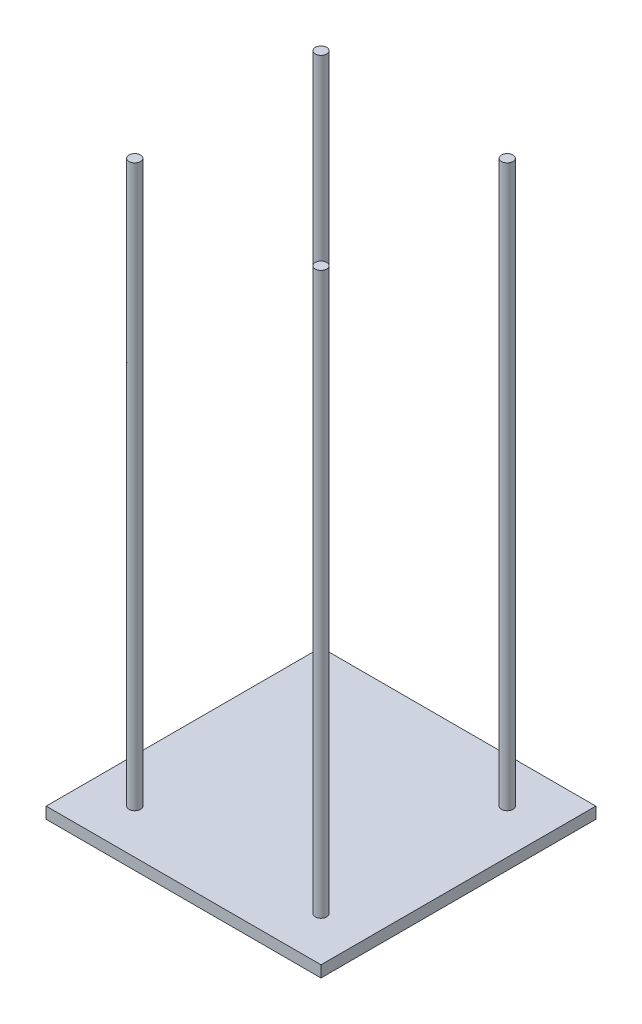
ISO-10303-21;
HEADER;
FILE_DESCRIPTION(('STEP AP214'),'2;1');
FILE_NAME('part.step','',(''),(''),'','','');
FILE_SCHEMA(('AUTOMOTIVE_DESIGN { 1 0 10303 214 1 1 1 1 }'));
ENDSEC;
DATA;
#1=APPLICATION_CONTEXT('core data for automotive mechanical design processes');
#2=APPLICATION_PROTOCOL_DEFINITION('international standard','automotive_design',2000,#1);
#3=PRODUCT_CONTEXT('',#1,'mechanical');
#4=PRODUCT('Part','Part','',(#3));
#5=PRODUCT_RELATED_PRODUCT_CATEGORY('part','',(#4));
#6=PRODUCT_DEFINITION_FORMATION('','',#4);
#7=PRODUCT_DEFINITION_CONTEXT('part definition',#1,'design');
#8=PRODUCT_DEFINITION('design','',#6,#7);
#9=PRODUCT_DEFINITION_SHAPE('','',#8);
#10=(LENGTH_UNIT() NAMED_UNIT(*) SI_UNIT(.MILLI.,.METRE.));
#11=(NAMED_UNIT(*) PLANE_ANGLE_UNIT() SI_UNIT($,.RADIAN.));
#12=(NAMED_UNIT(*) SI_UNIT($,.STERADIAN.) SOLID_ANGLE_UNIT());
#13=UNCERTAINTY_MEASURE_WITH_UNIT(LENGTH_MEASURE(1.E-05),#10,'distance_accuracy_value','');
#14=(GEOMETRIC_REPRESENTATION_CONTEXT(3) GLOBAL_UNCERTAINTY_ASSIGNED_CONTEXT((#13)) GLOBAL_UNIT_ASSIGNED_CONTEXT((#10,
#11,#12)) REPRESENTATION_CONTEXT('',''));
#15=CARTESIAN_POINT('',(0.,0.,0.));
#16=DIRECTION('',(0.,0.,1.));
#17=DIRECTION('',(1.,0.,0.));
#18=AXIS2_PLACEMENT_3D('',#15,#16,#17);
#19=CARTESIAN_POINT('',(60.0000000000006,5.,0.));
#20=DIRECTION('',(1.,0.,0.));
#21=DIRECTION('',(0.,0.,-1.));
#22=AXIS2_PLACEMENT_3D('',#19,#20,#21);
#23=PLANE('',#22);
#24=DIRECTION('',(0.,0.,1.));
#25=VECTOR('',#24,1.);
#26=CARTESIAN_POINT('',(60.0000000000006,0.,0.));
#27=LINE('',#26,#25);
#28=CARTESIAN_POINT('',(60.0000000000006,0.,-60.));
#29=VERTEX_POINT('',#28);
#30=CARTESIAN_POINT('',(60.0000000000007,0.,60.));
#31=VERTEX_POINT('',#30);
#32=EDGE_CURVE('E119',#29,#31,#27,.T.);
#33=ORIENTED_EDGE('',*,*,#32,.F.);
#34=DIRECTION('',(0.,-1.,0.));
#35=VECTOR('',#34,1.);
#36=CARTESIAN_POINT('',(60.0000000000006,5.,-60.));
#37=LINE('',#36,#35);
#38=CARTESIAN_POINT('',(60.0000000000006,5.,-60.));
#39=VERTEX_POINT('',#38);
#40=EDGE_CURVE('E11',#39,#29,#37,.T.);
#41=ORIENTED_EDGE('',*,*,#40,.F.);
#42=DIRECTION('',(0.,0.,1.));
#43=VECTOR('',#42,1.);
#44=CARTESIAN_POINT('',(60.0000000000006,5.,0.));
#45=LINE('',#44,#43);
#46=CARTESIAN_POINT('',(60.0000000000007,5.,60.));
#47=VERTEX_POINT('',#46);
#48=EDGE_CURVE('E107',#39,#47,#45,.T.);
#49=ORIENTED_EDGE('',*,*,#48,.T.);
#50=DIRECTION('',(0.,-1.,0.));
#51=VECTOR('',#50,1.);
#52=CARTESIAN_POINT('',(60.0000000000007,5.,60.));
#53=LINE('',#52,#51);
#54=EDGE_CURVE('E83',#47,#31,#53,.T.);
#55=ORIENTED_EDGE('',*,*,#54,.T.);
#56=EDGE_LOOP('',(#33,#41,#49,#55));
#57=FACE_BOUND('',#56,.T.);
#58=ADVANCED_FACE('F44',(#57),#23,.T.);
#59=CARTESIAN_POINT('',(0.,5.,-60.));
#60=DIRECTION('',(0.,0.,-1.));
#61=DIRECTION('',(-1.,0.,0.));
#62=AXIS2_PLACEMENT_3D('',#59,#60,#61);
#63=PLANE('',#62);
#64=DIRECTION('',(1.,0.,0.));
#65=VECTOR('',#64,1.);
#66=CARTESIAN_POINT('',(0.,0.,-60.));
#67=LINE('',#66,#65);
#68=CARTESIAN_POINT('',(-60.0000000000006,0.,-60.));
#69=VERTEX_POINT('',#68);
#70=EDGE_CURVE('E100',#69,#29,#67,.T.);
#71=ORIENTED_EDGE('',*,*,#70,.F.);
#72=DIRECTION('',(0.,-1.,0.));
#73=VECTOR('',#72,1.);
#74=CARTESIAN_POINT('',(-60.0000000000006,5.,-60.));
#75=LINE('',#74,#73);
#76=CARTESIAN_POINT('',(-60.0000000000006,5.,-60.));
#77=VERTEX_POINT('',#76);
#78=EDGE_CURVE('E53',#77,#69,#75,.T.);
#79=ORIENTED_EDGE('',*,*,#78,.F.);
#80=DIRECTION('',(1.,0.,0.));
#81=VECTOR('',#80,1.);
#82=CARTESIAN_POINT('',(0.,5.,-60.));
#83=LINE('',#82,#81);
#84=EDGE_CURVE('E92',#77,#39,#83,.T.);
#85=ORIENTED_EDGE('',*,*,#84,.T.);
#86=ORIENTED_EDGE('',*,*,#40,.T.);
#87=EDGE_LOOP('',(#71,#79,#85,#86));
#88=FACE_BOUND('',#87,.T.);
#89=ADVANCED_FACE('F91',(#88),#63,.T.);
#90=CARTESIAN_POINT('',(-60.0000000000005,5.,1.56125112837913E-13));
#91=DIRECTION('',(1.,0.,0.));
#92=DIRECTION('',(0.,0.,-1.));
#93=AXIS2_PLACEMENT_3D('',#90,#91,#92);
#94=PLANE('',#93);
#95=DIRECTION('',(0.,0.,1.));
#96=VECTOR('',#95,1.);
#97=CARTESIAN_POINT('',(-60.0000000000005,0.,1.56125112837913E-13));
#98=LINE('',#97,#96);
#99=CARTESIAN_POINT('',(-60.0000000000003,0.,60.0000000000003));
#100=VERTEX_POINT('',#99);
#101=EDGE_CURVE('E121',#69,#100,#98,.T.);
#102=ORIENTED_EDGE('',*,*,#101,.T.);
#103=DIRECTION('',(0.,-1.,0.));
#104=VECTOR('',#103,1.);
#105=CARTESIAN_POINT('',(-60.0000000000003,5.,60.0000000000003));
#106=LINE('',#105,#104);
#107=CARTESIAN_POINT('',(-60.0000000000003,5.,60.0000000000003));
#108=VERTEX_POINT('',#107);
#109=EDGE_CURVE('E101',#108,#100,#106,.T.);
#110=ORIENTED_EDGE('',*,*,#109,.F.);
#111=DIRECTION('',(0.,0.,1.));
#112=VECTOR('',#111,1.);
#113=CARTESIAN_POINT('',(-60.0000000000005,5.,1.56125112837913E-13));
#114=LINE('',#113,#112);
#115=EDGE_CURVE('E103',#77,#108,#114,.T.);
#116=ORIENTED_EDGE('',*,*,#115,.F.);
#117=ORIENTED_EDGE('',*,*,#78,.T.);
#118=EDGE_LOOP('',(#102,#110,#116,#117));
#119=FACE_BOUND('',#118,.T.);
#120=ADVANCED_FACE('F102',(#119),#94,.F.);
#121=CARTESIAN_POINT('',(1.63064006741819E-13,5.,60.0000000000002));
#122=DIRECTION('',(0.,0.,-1.));
#123=DIRECTION('',(-1.,0.,0.));
#124=AXIS2_PLACEMENT_3D('',#121,#122,#123);
#125=PLANE('',#124);
#126=DIRECTION('',(1.,0.,0.));
#127=VECTOR('',#126,1.);
#128=CARTESIAN_POINT('',(1.63064006741819E-13,0.,60.0000000000002));
#129=LINE('',#128,#127);
#130=EDGE_CURVE('E79',#100,#31,#129,.T.);
#131=ORIENTED_EDGE('',*,*,#130,.T.);
#132=ORIENTED_EDGE('',*,*,#54,.F.);
#133=DIRECTION('',(1.,0.,0.));
#134=VECTOR('',#133,1.);
#135=CARTESIAN_POINT('',(1.63064006741819E-13,5.,60.0000000000002));
#136=LINE('',#135,#134);
#137=EDGE_CURVE('E65',#108,#47,#136,.T.);
#138=ORIENTED_EDGE('',*,*,#137,.F.);
#139=ORIENTED_EDGE('',*,*,#109,.T.);
#140=EDGE_LOOP('',(#131,#132,#138,#139));
#141=FACE_BOUND('',#140,.T.);
#142=ADVANCED_FACE('F131',(#141),#125,.F.);
#143=CARTESIAN_POINT('',(0.,5.,0.));
#144=DIRECTION('',(0.,1.,0.));
#145=DIRECTION('',(0.,0.,1.));
#146=AXIS2_PLACEMENT_3D('',#143,#144,#145);
#147=PLANE('',#146);
#148=CARTESIAN_POINT('',(-40.6586399182267,5.,40.6586399182263));
#149=DIRECTION('',(0.,1.,0.));
#150=DIRECTION('',(0.,0.,1.));
#151=AXIS2_PLACEMENT_3D('',#148,#149,#150);
#152=CIRCLE('',#151,2.5);
#153=CARTESIAN_POINT('',(-40.6586399182267,5.,43.1586399182263));
#154=VERTEX_POINT('',#153);
#155=EDGE_CURVE('E129',#154,#154,#152,.T.);
#156=ORIENTED_EDGE('',*,*,#155,.F.);
#157=EDGE_LOOP('',(#156));
#158=FACE_BOUND('',#157,.T.);
#159=CARTESIAN_POINT('',(40.6586399182267,5.,-40.6586399182263));
#160=DIRECTION('',(0.,1.,0.));
#161=DIRECTION('',(0.,0.,1.));
#162=AXIS2_PLACEMENT_3D('',#159,#160,#161);
#163=CIRCLE('',#162,2.5);
#164=CARTESIAN_POINT('',(40.6586399182267,5.,-38.1586399182263));
#165=VERTEX_POINT('',#164);
#166=EDGE_CURVE('E206',#165,#165,#163,.T.);
#167=ORIENTED_EDGE('',*,*,#166,.F.);
#168=EDGE_LOOP('',(#167));
#169=FACE_BOUND('',#168,.T.);
#170=CARTESIAN_POINT('',(40.6586399182267,5.,40.6586399182263));
#171=DIRECTION('',(0.,1.,0.));
#172=DIRECTION('',(0.,0.,1.));
#173=AXIS2_PLACEMENT_3D('',#170,#171,#172);
#174=CIRCLE('',#173,2.5);
#175=CARTESIAN_POINT('',(40.6586399182267,5.,43.1586399182263));
#176=VERTEX_POINT('',#175);
#177=EDGE_CURVE('E209',#176,#176,#174,.T.);
#178=ORIENTED_EDGE('',*,*,#177,.F.);
#179=EDGE_LOOP('',(#178));
#180=FACE_BOUND('',#179,.T.);
#181=CARTESIAN_POINT('',(-40.6586399182267,5.,-40.6586399182263));
#182=DIRECTION('',(0.,1.,0.));
#183=DIRECTION('',(0.,0.,1.));
#184=AXIS2_PLACEMENT_3D('',#181,#182,#183);
#185=CIRCLE('',#184,2.5);
#186=CARTESIAN_POINT('',(-40.6586399182267,5.,-38.1586399182263));
#187=VERTEX_POINT('',#186);
#188=EDGE_CURVE('E115',#187,#187,#185,.T.);
#189=ORIENTED_EDGE('',*,*,#188,.F.);
#190=EDGE_LOOP('',(#189));
#191=FACE_BOUND('',#190,.T.);
#192=ORIENTED_EDGE('',*,*,#48,.F.);
#193=ORIENTED_EDGE('',*,*,#84,.F.);
#194=ORIENTED_EDGE('',*,*,#115,.T.);
#195=ORIENTED_EDGE('',*,*,#137,.T.);
#196=EDGE_LOOP('',(#192,#193,#194,#195));
#197=FACE_BOUND('',#196,.T.);
#198=ADVANCED_FACE('F110',(#158,#169,#180,#191,#197),#147,.T.);
#199=CARTESIAN_POINT('',(0.,0.,0.));
#200=DIRECTION('',(0.,1.,0.));
#201=DIRECTION('',(0.,0.,1.));
#202=AXIS2_PLACEMENT_3D('',#199,#200,#201);
#203=PLANE('',#202);
#204=ORIENTED_EDGE('',*,*,#32,.T.);
#205=ORIENTED_EDGE('',*,*,#130,.F.);
#206=ORIENTED_EDGE('',*,*,#101,.F.);
#207=ORIENTED_EDGE('',*,*,#70,.T.);
#208=EDGE_LOOP('',(#204,#205,#206,#207));
#209=FACE_BOUND('',#208,.T.);
#210=ADVANCED_FACE('F133',(#209),#203,.F.);
#211=CARTESIAN_POINT('',(-40.6586399182267,250.,40.6586399182263));
#212=DIRECTION('',(0.,-1.,0.));
#213=DIRECTION('',(0.,0.,-1.));
#214=AXIS2_PLACEMENT_3D('',#211,#212,#213);
#215=CYLINDRICAL_SURFACE('',#214,2.5);
#216=ORIENTED_EDGE('',*,*,#155,.T.);
#217=EDGE_LOOP('',(#216));
#218=FACE_BOUND('',#217,.T.);
#219=CARTESIAN_POINT('',(-40.6586399182267,250.,40.6586399182263));
#220=DIRECTION('',(0.,1.,0.));
#221=DIRECTION('',(0.,0.,1.));
#222=AXIS2_PLACEMENT_3D('',#219,#220,#221);
#223=CIRCLE('',#222,2.5);
#224=CARTESIAN_POINT('',(-40.6586399182267,250.,43.1586399182263));
#225=VERTEX_POINT('',#224);
#226=EDGE_CURVE('E122',#225,#225,#223,.T.);
#227=ORIENTED_EDGE('',*,*,#226,.F.);
#228=EDGE_LOOP('',(#227));
#229=FACE_BOUND('',#228,.T.);
#230=ADVANCED_FACE('F149',(#218,#229),#215,.T.);
#231=CARTESIAN_POINT('',(0.,250.,0.));
#232=DIRECTION('',(0.,1.,0.));
#233=DIRECTION('',(0.,0.,1.));
#234=AXIS2_PLACEMENT_3D('',#231,#232,#233);
#235=PLANE('',#234);
#236=ORIENTED_EDGE('',*,*,#226,.T.);
#237=EDGE_LOOP('',(#236));
#238=FACE_BOUND('',#237,.T.);
#239=ADVANCED_FACE('F154',(#238),#235,.T.);
#240=CARTESIAN_POINT('',(-40.6586399182267,250.,-40.6586399182263));
#241=DIRECTION('',(0.,-1.,0.));
#242=DIRECTION('',(0.,0.,-1.));
#243=AXIS2_PLACEMENT_3D('',#240,#241,#242);
#244=CYLINDRICAL_SURFACE('',#243,2.5);
#245=ORIENTED_EDGE('',*,*,#188,.T.);
#246=EDGE_LOOP('',(#245));
#247=FACE_BOUND('',#246,.T.);
#248=CARTESIAN_POINT('',(-40.6586399182267,250.,-40.6586399182263));
#249=DIRECTION('',(0.,1.,0.));
#250=DIRECTION('',(0.,0.,1.));
#251=AXIS2_PLACEMENT_3D('',#248,#249,#250);
#252=CIRCLE('',#251,2.5);
#253=CARTESIAN_POINT('',(-40.6586399182267,250.,-38.1586399182263));
#254=VERTEX_POINT('',#253);
#255=EDGE_CURVE('E190',#254,#254,#252,.T.);
#256=ORIENTED_EDGE('',*,*,#255,.F.);
#257=EDGE_LOOP('',(#256));
#258=FACE_BOUND('',#257,.T.);
#259=ADVANCED_FACE('F157',(#247,#258),#244,.T.);
#260=CARTESIAN_POINT('',(0.,250.,0.));
#261=DIRECTION('',(0.,1.,0.));
#262=DIRECTION('',(0.,0.,1.));
#263=AXIS2_PLACEMENT_3D('',#260,#261,#262);
#264=PLANE('',#263);
#265=ORIENTED_EDGE('',*,*,#255,.T.);
#266=EDGE_LOOP('',(#265));
#267=FACE_BOUND('',#266,.T.);
#268=ADVANCED_FACE('F174',(#267),#264,.T.);
#269=CARTESIAN_POINT('',(40.6586399182267,250.,-40.6586399182263));
#270=DIRECTION('',(0.,-1.,0.));
#271=DIRECTION('',(0.,0.,-1.));
#272=AXIS2_PLACEMENT_3D('',#269,#270,#271);
#273=CYLINDRICAL_SURFACE('',#272,2.5);
#274=ORIENTED_EDGE('',*,*,#166,.T.);
#275=EDGE_LOOP('',(#274));
#276=FACE_BOUND('',#275,.T.);
#277=CARTESIAN_POINT('',(40.6586399182267,250.,-40.6586399182263));
#278=DIRECTION('',(0.,1.,0.));
#279=DIRECTION('',(0.,0.,1.));
#280=AXIS2_PLACEMENT_3D('',#277,#278,#279);
#281=CIRCLE('',#280,2.5);
#282=CARTESIAN_POINT('',(40.6586399182267,250.,-38.1586399182263));
#283=VERTEX_POINT('',#282);
#284=EDGE_CURVE('E188',#283,#283,#281,.T.);
#285=ORIENTED_EDGE('',*,*,#284,.F.);
#286=EDGE_LOOP('',(#285));
#287=FACE_BOUND('',#286,.T.);
#288=ADVANCED_FACE('F168',(#276,#287),#273,.T.);
#289=CARTESIAN_POINT('',(0.,250.,0.));
#290=DIRECTION('',(0.,1.,0.));
#291=DIRECTION('',(0.,0.,1.));
#292=AXIS2_PLACEMENT_3D('',#289,#290,#291);
#293=PLANE('',#292);
#294=ORIENTED_EDGE('',*,*,#284,.T.);
#295=EDGE_LOOP('',(#294));
#296=FACE_BOUND('',#295,.T.);
#297=ADVANCED_FACE('F164',(#296),#293,.T.);
#298=CARTESIAN_POINT('',(40.6586399182267,250.,40.6586399182263));
#299=DIRECTION('',(0.,-1.,0.));
#300=DIRECTION('',(0.,0.,-1.));
#301=AXIS2_PLACEMENT_3D('',#298,#299,#300);
#302=CYLINDRICAL_SURFACE('',#301,2.5);
#303=ORIENTED_EDGE('',*,*,#177,.T.);
#304=EDGE_LOOP('',(#303));
#305=FACE_BOUND('',#304,.T.);
#306=CARTESIAN_POINT('',(40.6586399182267,250.,40.6586399182263));
#307=DIRECTION('',(0.,1.,0.));
#308=DIRECTION('',(0.,0.,1.));
#309=AXIS2_PLACEMENT_3D('',#306,#307,#308);
#310=CIRCLE('',#309,2.5);
#311=CARTESIAN_POINT('',(40.6586399182267,250.,43.1586399182263));
#312=VERTEX_POINT('',#311);
#313=EDGE_CURVE('E197',#312,#312,#310,.T.);
#314=ORIENTED_EDGE('',*,*,#313,.F.);
#315=EDGE_LOOP('',(#314));
#316=FACE_BOUND('',#315,.T.);
#317=ADVANCED_FACE('F161',(#305,#316),#302,.T.);
#318=CARTESIAN_POINT('',(0.,250.,0.));
#319=DIRECTION('',(0.,1.,0.));
#320=DIRECTION('',(0.,0.,1.));
#321=AXIS2_PLACEMENT_3D('',#318,#319,#320);
#322=PLANE('',#321);
#323=ORIENTED_EDGE('',*,*,#313,.T.);
#324=EDGE_LOOP('',(#323));
#325=FACE_BOUND('',#324,.T.);
#326=ADVANCED_FACE('F163',(#325),#322,.T.);
#327=CLOSED_SHELL('',(#58,#89,#120,#142,#198,#210,#230,#239,#259,#268,#288,#297,#317,#326));
#328=MANIFOLD_SOLID_BREP('B2',#327);
#329=ADVANCED_BREP_SHAPE_REPRESENTATION('',(#18,#328),#14);
#330=SHAPE_DEFINITION_REPRESENTATION(#9,#329);
ENDSEC;
END-ISO-10303-21;
